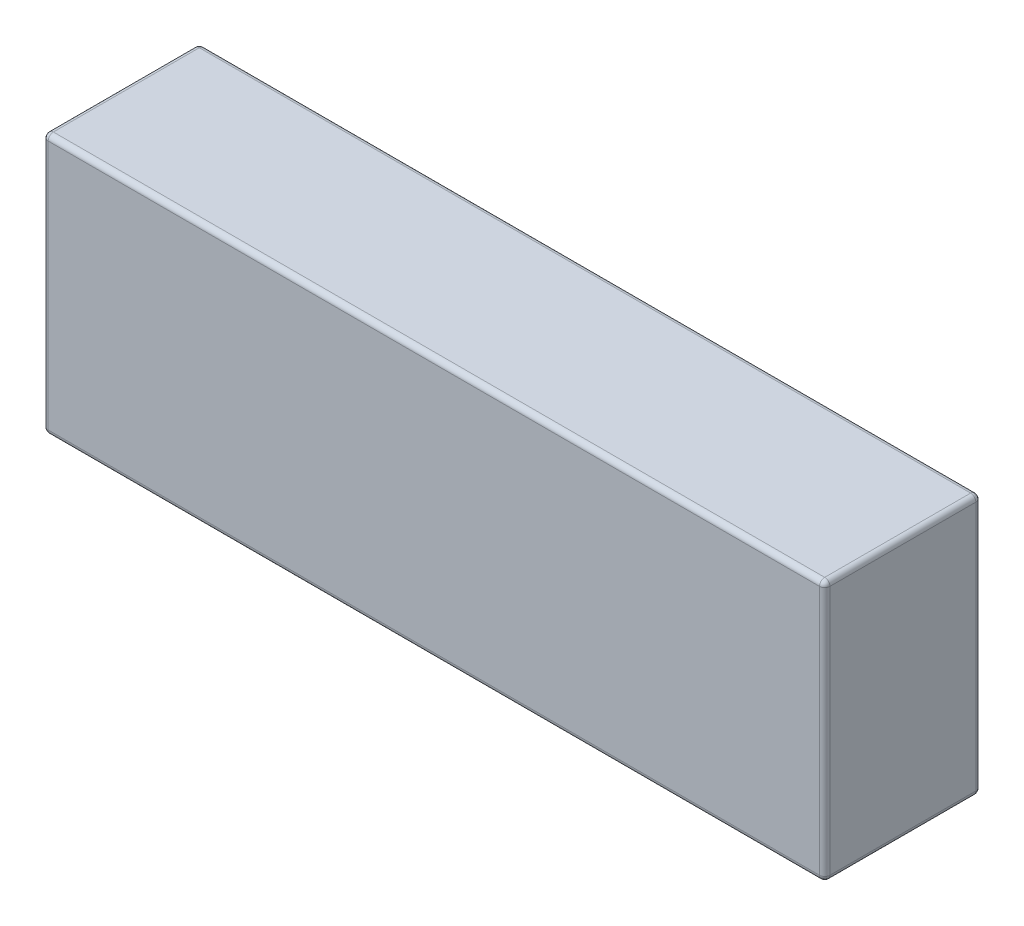
ISO-10303-21;
HEADER;
FILE_DESCRIPTION(('STEP AP214'),'2;1');
FILE_NAME('part.step','',(''),(''),'','','');
FILE_SCHEMA(('AUTOMOTIVE_DESIGN { 1 0 10303 214 1 1 1 1 }'));
ENDSEC;
DATA;
#1=APPLICATION_CONTEXT('core data for automotive mechanical design processes');
#2=APPLICATION_PROTOCOL_DEFINITION('international standard','automotive_design',2000,#1);
#3=PRODUCT_CONTEXT('',#1,'mechanical');
#4=PRODUCT('Part','Part','',(#3));
#5=PRODUCT_RELATED_PRODUCT_CATEGORY('part','',(#4));
#6=PRODUCT_DEFINITION_FORMATION('','',#4);
#7=PRODUCT_DEFINITION_CONTEXT('part definition',#1,'design');
#8=PRODUCT_DEFINITION('design','',#6,#7);
#9=PRODUCT_DEFINITION_SHAPE('','',#8);
#10=(LENGTH_UNIT() NAMED_UNIT(*) SI_UNIT(.MILLI.,.METRE.));
#11=(NAMED_UNIT(*) PLANE_ANGLE_UNIT() SI_UNIT($,.RADIAN.));
#12=(NAMED_UNIT(*) SI_UNIT($,.STERADIAN.) SOLID_ANGLE_UNIT());
#13=UNCERTAINTY_MEASURE_WITH_UNIT(LENGTH_MEASURE(1.E-05),#10,'distance_accuracy_value','');
#14=(GEOMETRIC_REPRESENTATION_CONTEXT(3) GLOBAL_UNCERTAINTY_ASSIGNED_CONTEXT((#13)) GLOBAL_UNIT_ASSIGNED_CONTEXT((#10,
#11,#12)) REPRESENTATION_CONTEXT('',''));
#15=CARTESIAN_POINT('',(0.,0.,0.));
#16=DIRECTION('',(0.,0.,1.));
#17=DIRECTION('',(1.,0.,0.));
#18=AXIS2_PLACEMENT_3D('',#15,#16,#17);
#19=CARTESIAN_POINT('',(75.,25.,28.));
#20=DIRECTION('',(-1.,0.,0.));
#21=DIRECTION('',(0.,0.,1.));
#22=AXIS2_PLACEMENT_3D('',#19,#20,#21);
#23=PLANE('',#22);
#24=DIRECTION('',(0.,-1.,0.));
#25=VECTOR('',#24,1.);
#26=CARTESIAN_POINT('',(75.,25.,0.));
#27=LINE('',#26,#25);
#28=CARTESIAN_POINT('',(75.,-24.,0.));
#29=VERTEX_POINT('',#28);
#30=CARTESIAN_POINT('',(75.,24.,0.));
#31=VERTEX_POINT('',#30);
#32=EDGE_CURVE('E188',#29,#31,#27,.F.);
#33=ORIENTED_EDGE('',*,*,#32,.T.);
#34=DIRECTION('',(0.,0.,-1.));
#35=VECTOR('',#34,1.);
#36=CARTESIAN_POINT('',(75.,24.,28.));
#37=LINE('',#36,#35);
#38=CARTESIAN_POINT('',(75.,24.,28.));
#39=VERTEX_POINT('',#38);
#40=EDGE_CURVE('E197',#31,#39,#37,.F.);
#41=ORIENTED_EDGE('',*,*,#40,.T.);
#42=DIRECTION('',(0.,1.,0.));
#43=VECTOR('',#42,1.);
#44=CARTESIAN_POINT('',(75.,-25.,28.));
#45=LINE('',#44,#43);
#46=CARTESIAN_POINT('',(75.,-24.,28.));
#47=VERTEX_POINT('',#46);
#48=EDGE_CURVE('E194',#39,#47,#45,.F.);
#49=ORIENTED_EDGE('',*,*,#48,.T.);
#50=DIRECTION('',(0.,0.,-1.));
#51=VECTOR('',#50,1.);
#52=CARTESIAN_POINT('',(75.,-24.,28.));
#53=LINE('',#52,#51);
#54=EDGE_CURVE('E191',#47,#29,#53,.T.);
#55=ORIENTED_EDGE('',*,*,#54,.T.);
#56=EDGE_LOOP('',(#33,#41,#49,#55));
#57=FACE_BOUND('',#56,.T.);
#58=ADVANCED_FACE('F44',(#57),#23,.F.);
#59=CARTESIAN_POINT('',(-75.,25.,28.));
#60=DIRECTION('',(0.,-1.,0.));
#61=DIRECTION('',(0.,0.,-1.));
#62=AXIS2_PLACEMENT_3D('',#59,#60,#61);
#63=PLANE('',#62);
#64=DIRECTION('',(0.,0.,-1.));
#65=VECTOR('',#64,1.);
#66=CARTESIAN_POINT('',(-74.,25.,28.));
#67=LINE('',#66,#65);
#68=CARTESIAN_POINT('',(-74.,25.,0.));
#69=VERTEX_POINT('',#68);
#70=CARTESIAN_POINT('',(-74.,25.,28.));
#71=VERTEX_POINT('',#70);
#72=EDGE_CURVE('E176',#69,#71,#67,.F.);
#73=ORIENTED_EDGE('',*,*,#72,.T.);
#74=DIRECTION('',(-1.,0.,0.));
#75=VECTOR('',#74,1.);
#76=CARTESIAN_POINT('',(75.,25.,28.));
#77=LINE('',#76,#75);
#78=CARTESIAN_POINT('',(74.,25.,28.));
#79=VERTEX_POINT('',#78);
#80=EDGE_CURVE('E140',#71,#79,#77,.F.);
#81=ORIENTED_EDGE('',*,*,#80,.T.);
#82=DIRECTION('',(0.,0.,-1.));
#83=VECTOR('',#82,1.);
#84=CARTESIAN_POINT('',(74.,25.,28.));
#85=LINE('',#84,#83);
#86=CARTESIAN_POINT('',(74.,25.,0.));
#87=VERTEX_POINT('',#86);
#88=EDGE_CURVE('E183',#79,#87,#85,.T.);
#89=ORIENTED_EDGE('',*,*,#88,.T.);
#90=DIRECTION('',(1.,0.,0.));
#91=VECTOR('',#90,1.);
#92=CARTESIAN_POINT('',(-75.,25.,0.));
#93=LINE('',#92,#91);
#94=EDGE_CURVE('E172',#87,#69,#93,.F.);
#95=ORIENTED_EDGE('',*,*,#94,.T.);
#96=EDGE_LOOP('',(#73,#81,#89,#95));
#97=FACE_BOUND('',#96,.T.);
#98=ADVANCED_FACE('F366',(#97),#63,.F.);
#99=CARTESIAN_POINT('',(-75.,25.,28.));
#100=DIRECTION('',(1.,0.,0.));
#101=DIRECTION('',(0.,1.,0.));
#102=AXIS2_PLACEMENT_3D('',#99,#100,#101);
#103=PLANE('',#102);
#104=DIRECTION('',(0.,0.,-1.));
#105=VECTOR('',#104,1.);
#106=CARTESIAN_POINT('',(-75.,-24.,28.));
#107=LINE('',#106,#105);
#108=CARTESIAN_POINT('',(-75.,-24.,0.));
#109=VERTEX_POINT('',#108);
#110=CARTESIAN_POINT('',(-75.,-24.,28.));
#111=VERTEX_POINT('',#110);
#112=EDGE_CURVE('E204',#109,#111,#107,.F.);
#113=ORIENTED_EDGE('',*,*,#112,.T.);
#114=DIRECTION('',(0.,-1.,0.));
#115=VECTOR('',#114,1.);
#116=CARTESIAN_POINT('',(-75.,25.,28.));
#117=LINE('',#116,#115);
#118=CARTESIAN_POINT('',(-75.,24.,28.));
#119=VERTEX_POINT('',#118);
#120=EDGE_CURVE('E211',#111,#119,#117,.F.);
#121=ORIENTED_EDGE('',*,*,#120,.T.);
#122=DIRECTION('',(0.,0.,-1.));
#123=VECTOR('',#122,1.);
#124=CARTESIAN_POINT('',(-75.,24.,28.));
#125=LINE('',#124,#123);
#126=CARTESIAN_POINT('',(-75.,24.,0.));
#127=VERTEX_POINT('',#126);
#128=EDGE_CURVE('E207',#119,#127,#125,.T.);
#129=ORIENTED_EDGE('',*,*,#128,.T.);
#130=DIRECTION('',(0.,1.,0.));
#131=VECTOR('',#130,1.);
#132=CARTESIAN_POINT('',(-75.,-25.,0.));
#133=LINE('',#132,#131);
#134=EDGE_CURVE('E201',#127,#109,#133,.F.);
#135=ORIENTED_EDGE('',*,*,#134,.T.);
#136=EDGE_LOOP('',(#113,#121,#129,#135));
#137=FACE_BOUND('',#136,.T.);
#138=ADVANCED_FACE('F392',(#137),#103,.F.);
#139=CARTESIAN_POINT('',(-75.,-25.,28.));
#140=DIRECTION('',(0.,1.,0.));
#141=DIRECTION('',(0.,0.,1.));
#142=AXIS2_PLACEMENT_3D('',#139,#140,#141);
#143=PLANE('',#142);
#144=DIRECTION('',(0.,0.,-1.));
#145=VECTOR('',#144,1.);
#146=CARTESIAN_POINT('',(74.,-25.,28.));
#147=LINE('',#146,#145);
#148=CARTESIAN_POINT('',(74.,-25.,0.));
#149=VERTEX_POINT('',#148);
#150=CARTESIAN_POINT('',(74.,-25.,28.));
#151=VERTEX_POINT('',#150);
#152=EDGE_CURVE('E217',#149,#151,#147,.F.);
#153=ORIENTED_EDGE('',*,*,#152,.T.);
#154=DIRECTION('',(1.,0.,0.));
#155=VECTOR('',#154,1.);
#156=CARTESIAN_POINT('',(-75.,-25.,28.));
#157=LINE('',#156,#155);
#158=CARTESIAN_POINT('',(-74.,-25.,28.));
#159=VERTEX_POINT('',#158);
#160=EDGE_CURVE('E224',#151,#159,#157,.F.);
#161=ORIENTED_EDGE('',*,*,#160,.T.);
#162=DIRECTION('',(0.,0.,-1.));
#163=VECTOR('',#162,1.);
#164=CARTESIAN_POINT('',(-74.,-25.,28.));
#165=LINE('',#164,#163);
#166=CARTESIAN_POINT('',(-74.,-25.,0.));
#167=VERTEX_POINT('',#166);
#168=EDGE_CURVE('E220',#159,#167,#165,.T.);
#169=ORIENTED_EDGE('',*,*,#168,.T.);
#170=DIRECTION('',(-1.,0.,0.));
#171=VECTOR('',#170,1.);
#172=CARTESIAN_POINT('',(75.,-25.,0.));
#173=LINE('',#172,#171);
#174=EDGE_CURVE('E214',#167,#149,#173,.F.);
#175=ORIENTED_EDGE('',*,*,#174,.T.);
#176=EDGE_LOOP('',(#153,#161,#169,#175));
#177=FACE_BOUND('',#176,.T.);
#178=ADVANCED_FACE('F335',(#177),#143,.F.);
#179=CARTESIAN_POINT('',(0.,0.,29.));
#180=DIRECTION('',(0.,0.,1.));
#181=DIRECTION('',(1.,0.,0.));
#182=AXIS2_PLACEMENT_3D('',#179,#180,#181);
#183=PLANE('',#182);
#184=DIRECTION('',(0.,1.,0.));
#185=VECTOR('',#184,1.);
#186=CARTESIAN_POINT('',(74.,25.,29.));
#187=LINE('',#186,#185);
#188=CARTESIAN_POINT('',(74.,-24.,29.));
#189=VERTEX_POINT('',#188);
#190=CARTESIAN_POINT('',(74.,24.,29.));
#191=VERTEX_POINT('',#190);
#192=EDGE_CURVE('E169',#189,#191,#187,.T.);
#193=ORIENTED_EDGE('',*,*,#192,.T.);
#194=DIRECTION('',(-1.,0.,0.));
#195=VECTOR('',#194,1.);
#196=CARTESIAN_POINT('',(-75.,24.,29.));
#197=LINE('',#196,#195);
#198=CARTESIAN_POINT('',(-74.,24.,29.));
#199=VERTEX_POINT('',#198);
#200=EDGE_CURVE('E138',#191,#199,#197,.T.);
#201=ORIENTED_EDGE('',*,*,#200,.T.);
#202=DIRECTION('',(0.,-1.,0.));
#203=VECTOR('',#202,1.);
#204=CARTESIAN_POINT('',(-74.,-25.,29.));
#205=LINE('',#204,#203);
#206=CARTESIAN_POINT('',(-74.,-24.,29.));
#207=VERTEX_POINT('',#206);
#208=EDGE_CURVE('E158',#199,#207,#205,.T.);
#209=ORIENTED_EDGE('',*,*,#208,.T.);
#210=DIRECTION('',(1.,0.,0.));
#211=VECTOR('',#210,1.);
#212=CARTESIAN_POINT('',(75.,-24.,29.));
#213=LINE('',#212,#211);
#214=EDGE_CURVE('E165',#207,#189,#213,.T.);
#215=ORIENTED_EDGE('',*,*,#214,.T.);
#216=EDGE_LOOP('',(#193,#201,#209,#215));
#217=FACE_BOUND('',#216,.T.);
#218=ADVANCED_FACE('F167',(#217),#183,.T.);
#219=CARTESIAN_POINT('',(0.,0.,-1.));
#220=DIRECTION('',(0.,0.,-1.));
#221=DIRECTION('',(-1.,0.,0.));
#222=AXIS2_PLACEMENT_3D('',#219,#220,#221);
#223=PLANE('',#222);
#224=DIRECTION('',(0.,-1.,0.));
#225=VECTOR('',#224,1.);
#226=CARTESIAN_POINT('',(74.,-25.,-1.));
#227=LINE('',#226,#225);
#228=CARTESIAN_POINT('',(74.,24.,-1.));
#229=VERTEX_POINT('',#228);
#230=CARTESIAN_POINT('',(74.,-24.,-1.));
#231=VERTEX_POINT('',#230);
#232=EDGE_CURVE('E54',#229,#231,#227,.T.);
#233=ORIENTED_EDGE('',*,*,#232,.T.);
#234=DIRECTION('',(-1.,0.,0.));
#235=VECTOR('',#234,1.);
#236=CARTESIAN_POINT('',(-75.,-24.,-1.));
#237=LINE('',#236,#235);
#238=CARTESIAN_POINT('',(-74.,-24.,-1.));
#239=VERTEX_POINT('',#238);
#240=EDGE_CURVE('E11',#231,#239,#237,.T.);
#241=ORIENTED_EDGE('',*,*,#240,.T.);
#242=DIRECTION('',(0.,1.,0.));
#243=VECTOR('',#242,1.);
#244=CARTESIAN_POINT('',(-74.,25.,-1.));
#245=LINE('',#244,#243);
#246=CARTESIAN_POINT('',(-74.,24.,-1.));
#247=VERTEX_POINT('',#246);
#248=EDGE_CURVE('E227',#239,#247,#245,.T.);
#249=ORIENTED_EDGE('',*,*,#248,.T.);
#250=DIRECTION('',(1.,0.,0.));
#251=VECTOR('',#250,1.);
#252=CARTESIAN_POINT('',(75.,24.,-1.));
#253=LINE('',#252,#251);
#254=EDGE_CURVE('E65',#247,#229,#253,.T.);
#255=ORIENTED_EDGE('',*,*,#254,.T.);
#256=EDGE_LOOP('',(#233,#241,#249,#255));
#257=FACE_BOUND('',#256,.T.);
#258=ADVANCED_FACE('F351',(#257),#223,.T.);
#259=CARTESIAN_POINT('',(0.,-24.,0.));
#260=DIRECTION('',(1.,0.,0.));
#261=DIRECTION('',(0.,0.,-1.));
#262=AXIS2_PLACEMENT_3D('',#259,#260,#261);
#263=CYLINDRICAL_SURFACE('',#262,1.);
#264=CARTESIAN_POINT('',(74.,-24.,0.));
#265=DIRECTION('',(1.,0.,0.));
#266=DIRECTION('',(0.,0.,-1.));
#267=AXIS2_PLACEMENT_3D('',#264,#265,#266);
#268=CIRCLE('',#267,1.);
#269=EDGE_CURVE('E48',#149,#231,#268,.T.);
#270=ORIENTED_EDGE('',*,*,#269,.F.);
#271=ORIENTED_EDGE('',*,*,#174,.F.);
#272=CARTESIAN_POINT('',(-74.,-24.,0.));
#273=DIRECTION('',(-1.,0.,0.));
#274=DIRECTION('',(0.,-1.,0.));
#275=AXIS2_PLACEMENT_3D('',#272,#273,#274);
#276=CIRCLE('',#275,1.);
#277=EDGE_CURVE('E303',#239,#167,#276,.T.);
#278=ORIENTED_EDGE('',*,*,#277,.F.);
#279=ORIENTED_EDGE('',*,*,#240,.F.);
#280=EDGE_LOOP('',(#270,#271,#278,#279));
#281=FACE_BOUND('',#280,.T.);
#282=ADVANCED_FACE('F46',(#281),#263,.T.);
#283=CARTESIAN_POINT('',(74.,-24.,0.));
#284=DIRECTION('',(0.,0.,-1.));
#285=DIRECTION('',(-1.,0.,0.));
#286=AXIS2_PLACEMENT_3D('',#283,#284,#285);
#287=SPHERICAL_SURFACE('',#286,1.);
#288=CARTESIAN_POINT('',(74.,-24.,0.));
#289=DIRECTION('',(0.,0.,-1.));
#290=DIRECTION('',(-1.,0.,0.));
#291=AXIS2_PLACEMENT_3D('',#288,#289,#290);
#292=CIRCLE('',#291,1.);
#293=EDGE_CURVE('E296',#149,#29,#292,.F.);
#294=ORIENTED_EDGE('',*,*,#293,.F.);
#295=ORIENTED_EDGE('',*,*,#269,.T.);
#296=CARTESIAN_POINT('',(74.,-24.,0.));
#297=DIRECTION('',(0.,-1.,0.));
#298=DIRECTION('',(0.,0.,-1.));
#299=AXIS2_PLACEMENT_3D('',#296,#297,#298);
#300=CIRCLE('',#299,1.);
#301=EDGE_CURVE('E300',#29,#231,#300,.F.);
#302=ORIENTED_EDGE('',*,*,#301,.F.);
#303=EDGE_LOOP('',(#294,#295,#302));
#304=FACE_BOUND('',#303,.T.);
#305=ADVANCED_FACE('F317',(#304),#287,.T.);
#306=CARTESIAN_POINT('',(-74.,-24.,0.));
#307=DIRECTION('',(0.,-1.,0.));
#308=DIRECTION('',(0.,0.,-1.));
#309=AXIS2_PLACEMENT_3D('',#306,#307,#308);
#310=SPHERICAL_SURFACE('',#309,1.);
#311=CARTESIAN_POINT('',(-74.,-24.,0.));
#312=DIRECTION('',(0.,-1.,0.));
#313=DIRECTION('',(0.,0.,-1.));
#314=AXIS2_PLACEMENT_3D('',#311,#312,#313);
#315=CIRCLE('',#314,1.);
#316=EDGE_CURVE('E289',#239,#109,#315,.F.);
#317=ORIENTED_EDGE('',*,*,#316,.F.);
#318=ORIENTED_EDGE('',*,*,#277,.T.);
#319=CARTESIAN_POINT('',(-74.,-24.,0.));
#320=DIRECTION('',(0.,0.,-1.));
#321=DIRECTION('',(-1.,0.,0.));
#322=AXIS2_PLACEMENT_3D('',#319,#320,#321);
#323=CIRCLE('',#322,1.);
#324=EDGE_CURVE('E293',#109,#167,#323,.F.);
#325=ORIENTED_EDGE('',*,*,#324,.F.);
#326=EDGE_LOOP('',(#317,#318,#325));
#327=FACE_BOUND('',#326,.T.);
#328=ADVANCED_FACE('F348',(#327),#310,.T.);
#329=CARTESIAN_POINT('',(74.,0.,0.));
#330=DIRECTION('',(0.,1.,0.));
#331=DIRECTION('',(0.,0.,1.));
#332=AXIS2_PLACEMENT_3D('',#329,#330,#331);
#333=CYLINDRICAL_SURFACE('',#332,1.);
#334=ORIENTED_EDGE('',*,*,#301,.T.);
#335=ORIENTED_EDGE('',*,*,#232,.F.);
#336=CARTESIAN_POINT('',(74.,24.,0.));
#337=DIRECTION('',(0.,1.,0.));
#338=DIRECTION('',(0.,0.,1.));
#339=AXIS2_PLACEMENT_3D('',#336,#337,#338);
#340=CIRCLE('',#339,1.);
#341=EDGE_CURVE('E281',#31,#229,#340,.T.);
#342=ORIENTED_EDGE('',*,*,#341,.F.);
#343=ORIENTED_EDGE('',*,*,#32,.F.);
#344=EDGE_LOOP('',(#334,#335,#342,#343));
#345=FACE_BOUND('',#344,.T.);
#346=ADVANCED_FACE('F322',(#345),#333,.T.);
#347=CARTESIAN_POINT('',(74.,-24.,28.));
#348=DIRECTION('',(0.,0.,-1.));
#349=DIRECTION('',(-1.,0.,0.));
#350=AXIS2_PLACEMENT_3D('',#347,#348,#349);
#351=CYLINDRICAL_SURFACE('',#350,1.);
#352=ORIENTED_EDGE('',*,*,#293,.T.);
#353=ORIENTED_EDGE('',*,*,#54,.F.);
#354=CARTESIAN_POINT('',(74.,-24.,28.));
#355=DIRECTION('',(0.,0.,1.));
#356=DIRECTION('',(1.,0.,0.));
#357=AXIS2_PLACEMENT_3D('',#354,#355,#356);
#358=CIRCLE('',#357,1.);
#359=EDGE_CURVE('E277',#151,#47,#358,.T.);
#360=ORIENTED_EDGE('',*,*,#359,.F.);
#361=ORIENTED_EDGE('',*,*,#152,.F.);
#362=EDGE_LOOP('',(#352,#353,#360,#361));
#363=FACE_BOUND('',#362,.T.);
#364=ADVANCED_FACE('F332',(#363),#351,.T.);
#365=CARTESIAN_POINT('',(0.,-24.,28.));
#366=DIRECTION('',(-1.,0.,0.));
#367=DIRECTION('',(0.,0.,1.));
#368=AXIS2_PLACEMENT_3D('',#365,#366,#367);
#369=CYLINDRICAL_SURFACE('',#368,1.);
#370=CARTESIAN_POINT('',(-74.,-24.,28.));
#371=DIRECTION('',(-1.,0.,0.));
#372=DIRECTION('',(0.,0.,1.));
#373=AXIS2_PLACEMENT_3D('',#370,#371,#372);
#374=CIRCLE('',#373,1.);
#375=EDGE_CURVE('E269',#159,#207,#374,.T.);
#376=ORIENTED_EDGE('',*,*,#375,.F.);
#377=ORIENTED_EDGE('',*,*,#160,.F.);
#378=CARTESIAN_POINT('',(74.,-24.,28.));
#379=DIRECTION('',(1.,0.,0.));
#380=DIRECTION('',(0.,0.,-1.));
#381=AXIS2_PLACEMENT_3D('',#378,#379,#380);
#382=CIRCLE('',#381,1.);
#383=EDGE_CURVE('E273',#189,#151,#382,.T.);
#384=ORIENTED_EDGE('',*,*,#383,.F.);
#385=ORIENTED_EDGE('',*,*,#214,.F.);
#386=EDGE_LOOP('',(#376,#377,#384,#385));
#387=FACE_BOUND('',#386,.T.);
#388=ADVANCED_FACE('F340',(#387),#369,.T.);
#389=CARTESIAN_POINT('',(-74.,-24.,28.));
#390=DIRECTION('',(0.,0.,-1.));
#391=DIRECTION('',(-1.,0.,0.));
#392=AXIS2_PLACEMENT_3D('',#389,#390,#391);
#393=CYLINDRICAL_SURFACE('',#392,1.);
#394=ORIENTED_EDGE('',*,*,#324,.T.);
#395=ORIENTED_EDGE('',*,*,#168,.F.);
#396=CARTESIAN_POINT('',(-74.,-24.,28.));
#397=DIRECTION('',(0.,0.,1.));
#398=DIRECTION('',(1.,0.,0.));
#399=AXIS2_PLACEMENT_3D('',#396,#397,#398);
#400=CIRCLE('',#399,1.);
#401=EDGE_CURVE('E265',#111,#159,#400,.T.);
#402=ORIENTED_EDGE('',*,*,#401,.F.);
#403=ORIENTED_EDGE('',*,*,#112,.F.);
#404=EDGE_LOOP('',(#394,#395,#402,#403));
#405=FACE_BOUND('',#404,.T.);
#406=ADVANCED_FACE('F347',(#405),#393,.T.);
#407=CARTESIAN_POINT('',(-74.,0.,0.));
#408=DIRECTION('',(0.,-1.,0.));
#409=DIRECTION('',(1.,0.,0.));
#410=AXIS2_PLACEMENT_3D('',#407,#408,#409);
#411=CYLINDRICAL_SURFACE('',#410,1.);
#412=ORIENTED_EDGE('',*,*,#316,.T.);
#413=ORIENTED_EDGE('',*,*,#134,.F.);
#414=CARTESIAN_POINT('',(-74.,24.,0.));
#415=DIRECTION('',(0.,1.,0.));
#416=DIRECTION('',(0.,0.,1.));
#417=AXIS2_PLACEMENT_3D('',#414,#415,#416);
#418=CIRCLE('',#417,1.);
#419=EDGE_CURVE('E261',#247,#127,#418,.T.);
#420=ORIENTED_EDGE('',*,*,#419,.F.);
#421=ORIENTED_EDGE('',*,*,#248,.F.);
#422=EDGE_LOOP('',(#412,#413,#420,#421));
#423=FACE_BOUND('',#422,.T.);
#424=ADVANCED_FACE('F358',(#423),#411,.T.);
#425=CARTESIAN_POINT('',(0.,24.,0.));
#426=DIRECTION('',(-1.,0.,0.));
#427=DIRECTION('',(0.,0.,1.));
#428=AXIS2_PLACEMENT_3D('',#425,#426,#427);
#429=CYLINDRICAL_SURFACE('',#428,1.);
#430=CARTESIAN_POINT('',(74.,24.,0.));
#431=DIRECTION('',(1.,0.,0.));
#432=DIRECTION('',(0.,0.,-1.));
#433=AXIS2_PLACEMENT_3D('',#430,#431,#432);
#434=CIRCLE('',#433,1.);
#435=EDGE_CURVE('E285',#229,#87,#434,.T.);
#436=ORIENTED_EDGE('',*,*,#435,.F.);
#437=ORIENTED_EDGE('',*,*,#254,.F.);
#438=CARTESIAN_POINT('',(-74.,24.,0.));
#439=DIRECTION('',(-1.,0.,0.));
#440=DIRECTION('',(0.,0.,1.));
#441=AXIS2_PLACEMENT_3D('',#438,#439,#440);
#442=CIRCLE('',#441,1.);
#443=EDGE_CURVE('E257',#69,#247,#442,.T.);
#444=ORIENTED_EDGE('',*,*,#443,.F.);
#445=ORIENTED_EDGE('',*,*,#94,.F.);
#446=EDGE_LOOP('',(#436,#437,#444,#445));
#447=FACE_BOUND('',#446,.T.);
#448=ADVANCED_FACE('F355',(#447),#429,.T.);
#449=CARTESIAN_POINT('',(74.,24.,0.));
#450=DIRECTION('',(0.,0.,-1.));
#451=DIRECTION('',(-1.,0.,0.));
#452=AXIS2_PLACEMENT_3D('',#449,#450,#451);
#453=SPHERICAL_SURFACE('',#452,1.);
#454=ORIENTED_EDGE('',*,*,#341,.T.);
#455=ORIENTED_EDGE('',*,*,#435,.T.);
#456=CARTESIAN_POINT('',(74.,24.,0.));
#457=DIRECTION('',(0.,0.,-1.));
#458=DIRECTION('',(-1.,0.,0.));
#459=AXIS2_PLACEMENT_3D('',#456,#457,#458);
#460=CIRCLE('',#459,1.);
#461=EDGE_CURVE('E253',#31,#87,#460,.F.);
#462=ORIENTED_EDGE('',*,*,#461,.F.);
#463=EDGE_LOOP('',(#454,#455,#462));
#464=FACE_BOUND('',#463,.T.);
#465=ADVANCED_FACE('F369',(#464),#453,.T.);
#466=CARTESIAN_POINT('',(74.,-24.,28.));
#467=DIRECTION('',(0.,-1.,0.));
#468=DIRECTION('',(0.,0.,-1.));
#469=AXIS2_PLACEMENT_3D('',#466,#467,#468);
#470=SPHERICAL_SURFACE('',#469,1.);
#471=ORIENTED_EDGE('',*,*,#383,.T.);
#472=ORIENTED_EDGE('',*,*,#359,.T.);
#473=CARTESIAN_POINT('',(74.,-24.,28.));
#474=DIRECTION('',(0.,-1.,0.));
#475=DIRECTION('',(0.,0.,-1.));
#476=AXIS2_PLACEMENT_3D('',#473,#474,#475);
#477=CIRCLE('',#476,1.);
#478=EDGE_CURVE('E249',#189,#47,#477,.F.);
#479=ORIENTED_EDGE('',*,*,#478,.F.);
#480=EDGE_LOOP('',(#471,#472,#479));
#481=FACE_BOUND('',#480,.T.);
#482=ADVANCED_FACE('F378',(#481),#470,.T.);
#483=CARTESIAN_POINT('',(-74.,-24.,28.));
#484=DIRECTION('',(0.,-1.,0.));
#485=DIRECTION('',(0.,0.,-1.));
#486=AXIS2_PLACEMENT_3D('',#483,#484,#485);
#487=SPHERICAL_SURFACE('',#486,1.);
#488=ORIENTED_EDGE('',*,*,#401,.T.);
#489=ORIENTED_EDGE('',*,*,#375,.T.);
#490=CARTESIAN_POINT('',(-74.,-24.,28.));
#491=DIRECTION('',(0.,-1.,0.));
#492=DIRECTION('',(0.,0.,-1.));
#493=AXIS2_PLACEMENT_3D('',#490,#491,#492);
#494=CIRCLE('',#493,1.);
#495=EDGE_CURVE('E161',#111,#207,#494,.F.);
#496=ORIENTED_EDGE('',*,*,#495,.F.);
#497=EDGE_LOOP('',(#488,#489,#496));
#498=FACE_BOUND('',#497,.T.);
#499=ADVANCED_FACE('F344',(#498),#487,.T.);
#500=CARTESIAN_POINT('',(-74.,24.,0.));
#501=DIRECTION('',(0.,0.,-1.));
#502=DIRECTION('',(-1.,0.,0.));
#503=AXIS2_PLACEMENT_3D('',#500,#501,#502);
#504=SPHERICAL_SURFACE('',#503,1.);
#505=ORIENTED_EDGE('',*,*,#443,.T.);
#506=ORIENTED_EDGE('',*,*,#419,.T.);
#507=CARTESIAN_POINT('',(-74.,24.,0.));
#508=DIRECTION('',(0.,0.,-1.));
#509=DIRECTION('',(-1.,0.,0.));
#510=AXIS2_PLACEMENT_3D('',#507,#508,#509);
#511=CIRCLE('',#510,1.);
#512=EDGE_CURVE('E244',#69,#127,#511,.F.);
#513=ORIENTED_EDGE('',*,*,#512,.F.);
#514=EDGE_LOOP('',(#505,#506,#513));
#515=FACE_BOUND('',#514,.T.);
#516=ADVANCED_FACE('F360',(#515),#504,.T.);
#517=CARTESIAN_POINT('',(74.,24.,28.));
#518=DIRECTION('',(0.,0.,-1.));
#519=DIRECTION('',(-1.,0.,0.));
#520=AXIS2_PLACEMENT_3D('',#517,#518,#519);
#521=CYLINDRICAL_SURFACE('',#520,1.);
#522=ORIENTED_EDGE('',*,*,#461,.T.);
#523=ORIENTED_EDGE('',*,*,#88,.F.);
#524=CARTESIAN_POINT('',(74.,24.,28.));
#525=DIRECTION('',(0.,0.,1.));
#526=DIRECTION('',(1.,0.,0.));
#527=AXIS2_PLACEMENT_3D('',#524,#525,#526);
#528=CIRCLE('',#527,1.);
#529=EDGE_CURVE('E240',#39,#79,#528,.T.);
#530=ORIENTED_EDGE('',*,*,#529,.F.);
#531=ORIENTED_EDGE('',*,*,#40,.F.);
#532=EDGE_LOOP('',(#522,#523,#530,#531));
#533=FACE_BOUND('',#532,.T.);
#534=ADVANCED_FACE('F371',(#533),#521,.T.);
#535=CARTESIAN_POINT('',(74.,0.,28.));
#536=DIRECTION('',(0.,-1.,0.));
#537=DIRECTION('',(0.,0.,-1.));
#538=AXIS2_PLACEMENT_3D('',#535,#536,#537);
#539=CYLINDRICAL_SURFACE('',#538,1.);
#540=ORIENTED_EDGE('',*,*,#478,.T.);
#541=ORIENTED_EDGE('',*,*,#48,.F.);
#542=CARTESIAN_POINT('',(74.,24.,28.));
#543=DIRECTION('',(0.,1.,0.));
#544=DIRECTION('',(0.,0.,1.));
#545=AXIS2_PLACEMENT_3D('',#542,#543,#544);
#546=CIRCLE('',#545,1.);
#547=EDGE_CURVE('E155',#191,#39,#546,.T.);
#548=ORIENTED_EDGE('',*,*,#547,.F.);
#549=ORIENTED_EDGE('',*,*,#192,.F.);
#550=EDGE_LOOP('',(#540,#541,#548,#549));
#551=FACE_BOUND('',#550,.T.);
#552=ADVANCED_FACE('F376',(#551),#539,.T.);
#553=CARTESIAN_POINT('',(-74.,0.,28.));
#554=DIRECTION('',(0.,1.,0.));
#555=DIRECTION('',(-1.,0.,0.));
#556=AXIS2_PLACEMENT_3D('',#553,#554,#555);
#557=CYLINDRICAL_SURFACE('',#556,1.);
#558=ORIENTED_EDGE('',*,*,#495,.T.);
#559=ORIENTED_EDGE('',*,*,#208,.F.);
#560=CARTESIAN_POINT('',(-74.,24.,28.));
#561=DIRECTION('',(0.,1.,0.));
#562=DIRECTION('',(0.,0.,1.));
#563=AXIS2_PLACEMENT_3D('',#560,#561,#562);
#564=CIRCLE('',#563,1.);
#565=EDGE_CURVE('E147',#119,#199,#564,.T.);
#566=ORIENTED_EDGE('',*,*,#565,.F.);
#567=ORIENTED_EDGE('',*,*,#120,.F.);
#568=EDGE_LOOP('',(#558,#559,#566,#567));
#569=FACE_BOUND('',#568,.T.);
#570=ADVANCED_FACE('F159',(#569),#557,.T.);
#571=CARTESIAN_POINT('',(-74.,24.,28.));
#572=DIRECTION('',(0.,0.,-1.));
#573=DIRECTION('',(-1.,0.,0.));
#574=AXIS2_PLACEMENT_3D('',#571,#572,#573);
#575=CYLINDRICAL_SURFACE('',#574,1.);
#576=ORIENTED_EDGE('',*,*,#512,.T.);
#577=ORIENTED_EDGE('',*,*,#128,.F.);
#578=CARTESIAN_POINT('',(-74.,24.,28.));
#579=DIRECTION('',(0.,0.,1.));
#580=DIRECTION('',(1.,0.,0.));
#581=AXIS2_PLACEMENT_3D('',#578,#579,#580);
#582=CIRCLE('',#581,1.);
#583=EDGE_CURVE('E151',#71,#119,#582,.T.);
#584=ORIENTED_EDGE('',*,*,#583,.F.);
#585=ORIENTED_EDGE('',*,*,#72,.F.);
#586=EDGE_LOOP('',(#576,#577,#584,#585));
#587=FACE_BOUND('',#586,.T.);
#588=ADVANCED_FACE('F364',(#587),#575,.T.);
#589=CARTESIAN_POINT('',(74.,24.,28.));
#590=DIRECTION('',(1.,0.,0.));
#591=DIRECTION('',(0.,0.,-1.));
#592=AXIS2_PLACEMENT_3D('',#589,#590,#591);
#593=SPHERICAL_SURFACE('',#592,1.);
#594=ORIENTED_EDGE('',*,*,#547,.T.);
#595=ORIENTED_EDGE('',*,*,#529,.T.);
#596=CARTESIAN_POINT('',(74.,24.,28.));
#597=DIRECTION('',(1.,0.,0.));
#598=DIRECTION('',(0.,0.,-1.));
#599=AXIS2_PLACEMENT_3D('',#596,#597,#598);
#600=CIRCLE('',#599,1.);
#601=EDGE_CURVE('E144',#191,#79,#600,.F.);
#602=ORIENTED_EDGE('',*,*,#601,.F.);
#603=EDGE_LOOP('',(#594,#595,#602));
#604=FACE_BOUND('',#603,.T.);
#605=ADVANCED_FACE('F400',(#604),#593,.T.);
#606=CARTESIAN_POINT('',(-74.,24.,28.));
#607=DIRECTION('',(-1.,0.,0.));
#608=DIRECTION('',(0.,0.,1.));
#609=AXIS2_PLACEMENT_3D('',#606,#607,#608);
#610=SPHERICAL_SURFACE('',#609,1.);
#611=ORIENTED_EDGE('',*,*,#583,.T.);
#612=ORIENTED_EDGE('',*,*,#565,.T.);
#613=CARTESIAN_POINT('',(-74.,24.,28.));
#614=DIRECTION('',(-1.,0.,0.));
#615=DIRECTION('',(0.,-1.,0.));
#616=AXIS2_PLACEMENT_3D('',#613,#614,#615);
#617=CIRCLE('',#616,1.);
#618=EDGE_CURVE('E134',#71,#199,#617,.F.);
#619=ORIENTED_EDGE('',*,*,#618,.F.);
#620=EDGE_LOOP('',(#611,#612,#619));
#621=FACE_BOUND('',#620,.T.);
#622=ADVANCED_FACE('F149',(#621),#610,.T.);
#623=CARTESIAN_POINT('',(0.,24.,28.));
#624=DIRECTION('',(1.,0.,0.));
#625=DIRECTION('',(0.,0.,-1.));
#626=AXIS2_PLACEMENT_3D('',#623,#624,#625);
#627=CYLINDRICAL_SURFACE('',#626,1.);
#628=ORIENTED_EDGE('',*,*,#601,.T.);
#629=ORIENTED_EDGE('',*,*,#80,.F.);
#630=ORIENTED_EDGE('',*,*,#618,.T.);
#631=ORIENTED_EDGE('',*,*,#200,.F.);
#632=EDGE_LOOP('',(#628,#629,#630,#631));
#633=FACE_BOUND('',#632,.T.);
#634=ADVANCED_FACE('F136',(#633),#627,.T.);
#635=CLOSED_SHELL('',(#58,#98,#138,#178,#218,#258,#282,#305,#328,#346,#364,#388,#406,#424,#448,
#465,#482,#499,#516,#534,#552,#570,#588,#605,#622,#634));
#636=MANIFOLD_SOLID_BREP('B2',#635);
#637=ADVANCED_BREP_SHAPE_REPRESENTATION('',(#18,#636),#14);
#638=SHAPE_DEFINITION_REPRESENTATION(#9,#637);
ENDSEC;
END-ISO-10303-21;
